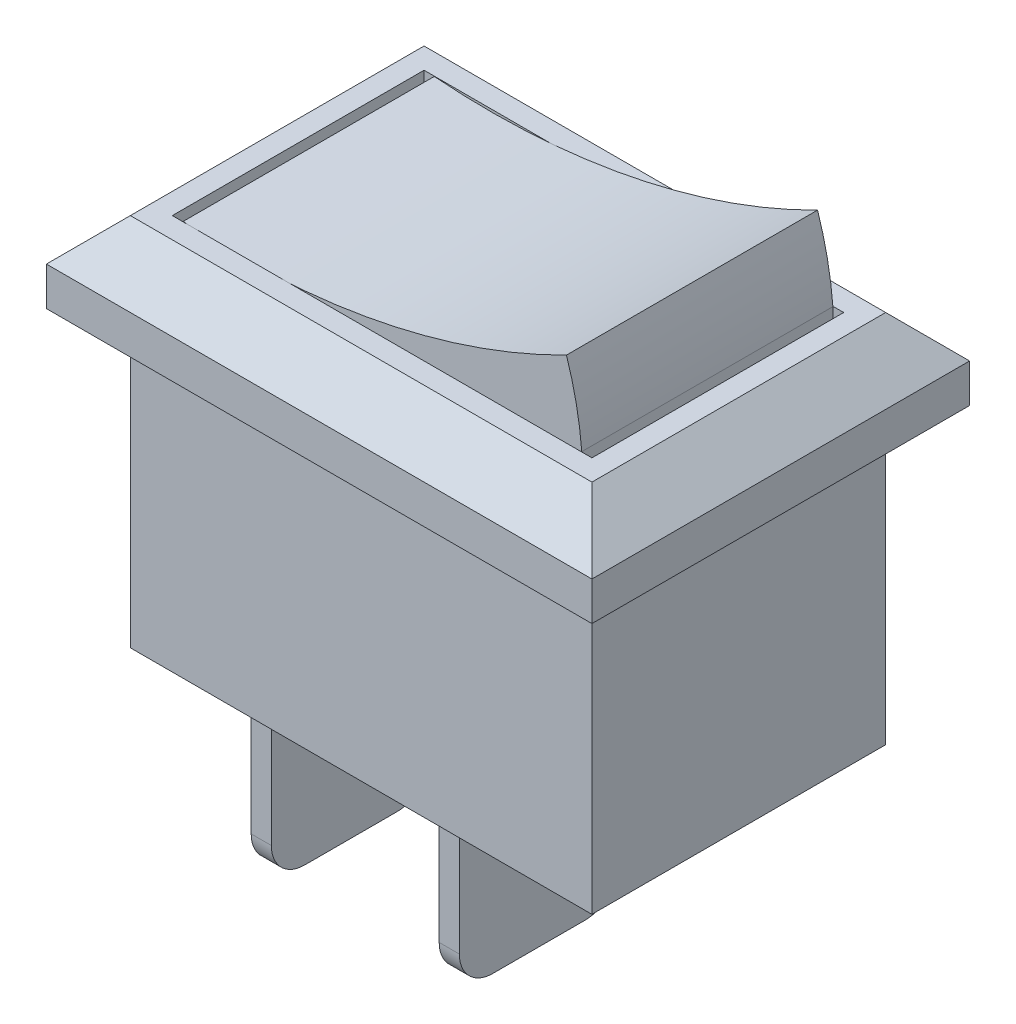
ISO-10303-21;
HEADER;
FILE_DESCRIPTION(('STEP AP214'),'2;1');
FILE_NAME('part.step','',(''),(''),'','','');
FILE_SCHEMA(('AUTOMOTIVE_DESIGN { 1 0 10303 214 1 1 1 1 }'));
ENDSEC;
DATA;
#1=APPLICATION_CONTEXT('core data for automotive mechanical design processes');
#2=APPLICATION_PROTOCOL_DEFINITION('international standard','automotive_design',2000,#1);
#3=PRODUCT_CONTEXT('',#1,'mechanical');
#4=PRODUCT('Part','Part','',(#3));
#5=PRODUCT_RELATED_PRODUCT_CATEGORY('part','',(#4));
#6=PRODUCT_DEFINITION_FORMATION('','',#4);
#7=PRODUCT_DEFINITION_CONTEXT('part definition',#1,'design');
#8=PRODUCT_DEFINITION('design','',#6,#7);
#9=PRODUCT_DEFINITION_SHAPE('','',#8);
#10=(LENGTH_UNIT() NAMED_UNIT(*) SI_UNIT(.MILLI.,.METRE.));
#11=(NAMED_UNIT(*) PLANE_ANGLE_UNIT() SI_UNIT($,.RADIAN.));
#12=(NAMED_UNIT(*) SI_UNIT($,.STERADIAN.) SOLID_ANGLE_UNIT());
#13=UNCERTAINTY_MEASURE_WITH_UNIT(LENGTH_MEASURE(1.E-05),#10,'distance_accuracy_value','');
#14=(GEOMETRIC_REPRESENTATION_CONTEXT(3) GLOBAL_UNCERTAINTY_ASSIGNED_CONTEXT((#13)) GLOBAL_UNIT_ASSIGNED_CONTEXT((#10,
#11,#12)) REPRESENTATION_CONTEXT('',''));
#15=CARTESIAN_POINT('',(0.,0.,0.));
#16=DIRECTION('',(0.,0.,1.));
#17=DIRECTION('',(1.,0.,0.));
#18=AXIS2_PLACEMENT_3D('',#15,#16,#17);
#19=CARTESIAN_POINT('',(0.,0.,0.));
#20=DIRECTION('',(0.,-1.,0.));
#21=DIRECTION('',(0.,0.,-1.));
#22=AXIS2_PLACEMENT_3D('',#19,#20,#21);
#23=PLANE('',#22);
#24=DIRECTION('',(0.,0.,1.));
#25=VECTOR('',#24,1.);
#26=CARTESIAN_POINT('',(0.,0.,0.));
#27=LINE('',#26,#25);
#28=CARTESIAN_POINT('',(0.,0.,-11.1125));
#29=VERTEX_POINT('',#28);
#30=CARTESIAN_POINT('',(0.,0.,0.));
#31=VERTEX_POINT('',#30);
#32=EDGE_CURVE('E614',#29,#31,#27,.T.);
#33=ORIENTED_EDGE('',*,*,#32,.F.);
#34=DIRECTION('',(-1.,0.,0.));
#35=VECTOR('',#34,1.);
#36=CARTESIAN_POINT('',(0.,0.,-11.1125));
#37=LINE('',#36,#35);
#38=CARTESIAN_POINT('',(17.4625,0.,-11.1125));
#39=VERTEX_POINT('',#38);
#40=EDGE_CURVE('E604',#39,#29,#37,.T.);
#41=ORIENTED_EDGE('',*,*,#40,.F.);
#42=DIRECTION('',(0.,0.,-1.));
#43=VECTOR('',#42,1.);
#44=CARTESIAN_POINT('',(17.4625,0.,0.));
#45=LINE('',#44,#43);
#46=CARTESIAN_POINT('',(17.4625,0.,0.));
#47=VERTEX_POINT('',#46);
#48=EDGE_CURVE('E608',#47,#39,#45,.T.);
#49=ORIENTED_EDGE('',*,*,#48,.F.);
#50=DIRECTION('',(1.,0.,0.));
#51=VECTOR('',#50,1.);
#52=CARTESIAN_POINT('',(0.,0.,0.));
#53=LINE('',#52,#51);
#54=EDGE_CURVE('E611',#31,#47,#53,.T.);
#55=ORIENTED_EDGE('',*,*,#54,.F.);
#56=EDGE_LOOP('',(#33,#41,#49,#55));
#57=FACE_BOUND('',#56,.T.);
#58=DIRECTION('',(1.,0.,0.));
#59=VECTOR('',#58,1.);
#60=CARTESIAN_POINT('',(2.032,0.,-8.5725));
#61=LINE('',#60,#59);
#62=CARTESIAN_POINT('',(2.032,0.,-8.5725));
#63=VERTEX_POINT('',#62);
#64=CARTESIAN_POINT('',(2.794,0.,-8.5725));
#65=VERTEX_POINT('',#64);
#66=EDGE_CURVE('E305',#63,#65,#61,.T.);
#67=ORIENTED_EDGE('',*,*,#66,.F.);
#68=DIRECTION('',(0.,0.,-1.));
#69=VECTOR('',#68,1.);
#70=CARTESIAN_POINT('',(2.032,0.,-2.54));
#71=LINE('',#70,#69);
#72=CARTESIAN_POINT('',(2.032,0.,-2.54));
#73=VERTEX_POINT('',#72);
#74=EDGE_CURVE('E259',#73,#63,#71,.T.);
#75=ORIENTED_EDGE('',*,*,#74,.F.);
#76=DIRECTION('',(-1.,0.,0.));
#77=VECTOR('',#76,1.);
#78=CARTESIAN_POINT('',(2.032,0.,-2.54));
#79=LINE('',#78,#77);
#80=CARTESIAN_POINT('',(2.794,0.,-2.54));
#81=VERTEX_POINT('',#80);
#82=EDGE_CURVE('E297',#81,#73,#79,.T.);
#83=ORIENTED_EDGE('',*,*,#82,.F.);
#84=DIRECTION('',(0.,0.,1.));
#85=VECTOR('',#84,1.);
#86=CARTESIAN_POINT('',(2.794,0.,-2.54));
#87=LINE('',#86,#85);
#88=EDGE_CURVE('E309',#65,#81,#87,.T.);
#89=ORIENTED_EDGE('',*,*,#88,.F.);
#90=EDGE_LOOP('',(#67,#75,#83,#89));
#91=FACE_BOUND('',#90,.T.);
#92=DIRECTION('',(1.,0.,0.));
#93=VECTOR('',#92,1.);
#94=CARTESIAN_POINT('',(9.144,0.,-8.5725));
#95=LINE('',#94,#93);
#96=CARTESIAN_POINT('',(9.144,0.,-8.5725));
#97=VERTEX_POINT('',#96);
#98=CARTESIAN_POINT('',(9.906,0.,-8.5725));
#99=VERTEX_POINT('',#98);
#100=EDGE_CURVE('E252',#97,#99,#95,.T.);
#101=ORIENTED_EDGE('',*,*,#100,.F.);
#102=DIRECTION('',(0.,0.,-1.));
#103=VECTOR('',#102,1.);
#104=CARTESIAN_POINT('',(9.144,0.,-2.54));
#105=LINE('',#104,#103);
#106=CARTESIAN_POINT('',(9.144,0.,-2.54));
#107=VERTEX_POINT('',#106);
#108=EDGE_CURVE('E263',#107,#97,#105,.T.);
#109=ORIENTED_EDGE('',*,*,#108,.F.);
#110=DIRECTION('',(-1.,0.,0.));
#111=VECTOR('',#110,1.);
#112=CARTESIAN_POINT('',(9.144,0.,-2.54));
#113=LINE('',#112,#111);
#114=CARTESIAN_POINT('',(9.906,0.,-2.54));
#115=VERTEX_POINT('',#114);
#116=EDGE_CURVE('E277',#115,#107,#113,.T.);
#117=ORIENTED_EDGE('',*,*,#116,.F.);
#118=DIRECTION('',(0.,0.,1.));
#119=VECTOR('',#118,1.);
#120=CARTESIAN_POINT('',(9.906,0.,-2.54));
#121=LINE('',#120,#119);
#122=EDGE_CURVE('E273',#99,#115,#121,.T.);
#123=ORIENTED_EDGE('',*,*,#122,.F.);
#124=EDGE_LOOP('',(#101,#109,#117,#123));
#125=FACE_BOUND('',#124,.T.);
#126=ADVANCED_FACE('F43',(#57,#91,#125),#23,.T.);
#127=CARTESIAN_POINT('',(0.,10.9855,0.));
#128=DIRECTION('',(0.,1.,0.));
#129=DIRECTION('',(0.,0.,1.));
#130=AXIS2_PLACEMENT_3D('',#127,#128,#129);
#131=PLANE('',#130);
#132=DIRECTION('',(0.,0.,1.));
#133=VECTOR('',#132,1.);
#134=CARTESIAN_POINT('',(0.793749999999999,10.9855,-10.31875));
#135=LINE('',#134,#133);
#136=CARTESIAN_POINT('',(0.793749999999999,10.9855,-10.31875));
#137=VERTEX_POINT('',#136);
#138=CARTESIAN_POINT('',(0.79375,10.9855,-0.79375));
#139=VERTEX_POINT('',#138);
#140=EDGE_CURVE('E676',#137,#139,#135,.T.);
#141=ORIENTED_EDGE('',*,*,#140,.T.);
#142=DIRECTION('',(1.,0.,0.));
#143=VECTOR('',#142,1.);
#144=CARTESIAN_POINT('',(0.79375,10.9855,-0.79375));
#145=LINE('',#144,#143);
#146=CARTESIAN_POINT('',(16.66875,10.9855,-0.79375));
#147=VERTEX_POINT('',#146);
#148=EDGE_CURVE('E696',#139,#147,#145,.T.);
#149=ORIENTED_EDGE('',*,*,#148,.T.);
#150=DIRECTION('',(0.,0.,-1.));
#151=VECTOR('',#150,1.);
#152=CARTESIAN_POINT('',(16.66875,10.9855,-10.31875));
#153=LINE('',#152,#151);
#154=CARTESIAN_POINT('',(16.66875,10.9855,-10.31875));
#155=VERTEX_POINT('',#154);
#156=EDGE_CURVE('E692',#147,#155,#153,.T.);
#157=ORIENTED_EDGE('',*,*,#156,.T.);
#158=DIRECTION('',(-1.,0.,0.));
#159=VECTOR('',#158,1.);
#160=CARTESIAN_POINT('',(0.793749999999999,10.9855,-10.31875));
#161=LINE('',#160,#159);
#162=EDGE_CURVE('E664',#155,#137,#161,.T.);
#163=ORIENTED_EDGE('',*,*,#162,.T.);
#164=EDGE_LOOP('',(#141,#149,#157,#163));
#165=FACE_BOUND('',#164,.T.);
#166=DIRECTION('',(0.,0.,1.));
#167=VECTOR('',#166,1.);
#168=CARTESIAN_POINT('',(1.190625,10.9855,-10.30605));
#169=LINE('',#168,#167);
#170=CARTESIAN_POINT('',(1.190625,10.9855,-10.30605));
#171=VERTEX_POINT('',#170);
#172=CARTESIAN_POINT('',(1.19062499999999,10.9855,-0.806449999999999));
#173=VERTEX_POINT('',#172);
#174=EDGE_CURVE('E703',#171,#173,#169,.T.);
#175=ORIENTED_EDGE('',*,*,#174,.F.);
#176=DIRECTION('',(1.,0.,0.));
#177=VECTOR('',#176,1.);
#178=CARTESIAN_POINT('',(1.190625,10.9855,-10.30605));
#179=LINE('',#178,#177);
#180=CARTESIAN_POINT('',(16.271875,10.9855,-10.30605));
#181=VERTEX_POINT('',#180);
#182=EDGE_CURVE('E356',#171,#181,#179,.T.);
#183=ORIENTED_EDGE('',*,*,#182,.T.);
#184=DIRECTION('',(0.,0.,1.));
#185=VECTOR('',#184,1.);
#186=CARTESIAN_POINT('',(16.271875,10.9855,-10.30605));
#187=LINE('',#186,#185);
#188=CARTESIAN_POINT('',(16.271875,10.9855,-0.806449999999999));
#189=VERTEX_POINT('',#188);
#190=EDGE_CURVE('E707',#181,#189,#187,.T.);
#191=ORIENTED_EDGE('',*,*,#190,.T.);
#192=DIRECTION('',(1.,0.,0.));
#193=VECTOR('',#192,1.);
#194=CARTESIAN_POINT('',(1.190625,10.9855,-0.806449999999999));
#195=LINE('',#194,#193);
#196=EDGE_CURVE('E331',#173,#189,#195,.T.);
#197=ORIENTED_EDGE('',*,*,#196,.F.);
#198=EDGE_LOOP('',(#175,#183,#191,#197));
#199=FACE_BOUND('',#198,.T.);
#200=ADVANCED_FACE('F393',(#165,#199),#131,.T.);
#201=CARTESIAN_POINT('',(0.,11.1125,0.));
#202=DIRECTION('',(1.,0.,0.));
#203=DIRECTION('',(0.,0.,-1.));
#204=AXIS2_PLACEMENT_3D('',#201,#202,#203);
#205=PLANE('',#204);
#206=ORIENTED_EDGE('',*,*,#32,.T.);
#207=DIRECTION('',(0.,-1.,0.));
#208=VECTOR('',#207,1.);
#209=CARTESIAN_POINT('',(0.,11.1125,0.));
#210=LINE('',#209,#208);
#211=CARTESIAN_POINT('',(0.,11.1125,0.));
#212=VERTEX_POINT('',#211);
#213=EDGE_CURVE('E587',#212,#31,#210,.T.);
#214=ORIENTED_EDGE('',*,*,#213,.F.);
#215=DIRECTION('',(0.,0.,1.));
#216=VECTOR('',#215,1.);
#217=CARTESIAN_POINT('',(0.,11.1125,0.));
#218=LINE('',#217,#216);
#219=CARTESIAN_POINT('',(0.,11.1125,-11.1125));
#220=VERTEX_POINT('',#219);
#221=EDGE_CURVE('E607',#220,#212,#218,.T.);
#222=ORIENTED_EDGE('',*,*,#221,.F.);
#223=DIRECTION('',(0.,-1.,0.));
#224=VECTOR('',#223,1.);
#225=CARTESIAN_POINT('',(0.,11.1125,-11.1125));
#226=LINE('',#225,#224);
#227=EDGE_CURVE('E599',#220,#29,#226,.T.);
#228=ORIENTED_EDGE('',*,*,#227,.T.);
#229=EDGE_LOOP('',(#206,#214,#222,#228));
#230=FACE_BOUND('',#229,.T.);
#231=ADVANCED_FACE('F396',(#230),#205,.F.);
#232=CARTESIAN_POINT('',(0.,11.1125,0.));
#233=DIRECTION('',(0.,0.,-1.));
#234=DIRECTION('',(-1.,0.,0.));
#235=AXIS2_PLACEMENT_3D('',#232,#233,#234);
#236=PLANE('',#235);
#237=ORIENTED_EDGE('',*,*,#54,.T.);
#238=DIRECTION('',(0.,-1.,0.));
#239=VECTOR('',#238,1.);
#240=CARTESIAN_POINT('',(17.4625,11.1125,0.));
#241=LINE('',#240,#239);
#242=CARTESIAN_POINT('',(17.4625,11.1125,0.));
#243=VERTEX_POINT('',#242);
#244=EDGE_CURVE('E591',#243,#47,#241,.T.);
#245=ORIENTED_EDGE('',*,*,#244,.F.);
#246=DIRECTION('',(1.,0.,0.));
#247=VECTOR('',#246,1.);
#248=CARTESIAN_POINT('',(0.,11.1125,0.));
#249=LINE('',#248,#247);
#250=EDGE_CURVE('E626',#212,#243,#249,.T.);
#251=ORIENTED_EDGE('',*,*,#250,.F.);
#252=ORIENTED_EDGE('',*,*,#213,.T.);
#253=EDGE_LOOP('',(#237,#245,#251,#252));
#254=FACE_BOUND('',#253,.T.);
#255=ADVANCED_FACE('F449',(#254),#236,.F.);
#256=CARTESIAN_POINT('',(17.4625,11.1125,0.));
#257=DIRECTION('',(-1.,0.,0.));
#258=DIRECTION('',(0.,0.,1.));
#259=AXIS2_PLACEMENT_3D('',#256,#257,#258);
#260=PLANE('',#259);
#261=ORIENTED_EDGE('',*,*,#48,.T.);
#262=DIRECTION('',(0.,-1.,0.));
#263=VECTOR('',#262,1.);
#264=CARTESIAN_POINT('',(17.4625,11.1125,-11.1125));
#265=LINE('',#264,#263);
#266=CARTESIAN_POINT('',(17.4625,11.1125,-11.1125));
#267=VERTEX_POINT('',#266);
#268=EDGE_CURVE('E595',#267,#39,#265,.T.);
#269=ORIENTED_EDGE('',*,*,#268,.F.);
#270=DIRECTION('',(0.,0.,-1.));
#271=VECTOR('',#270,1.);
#272=CARTESIAN_POINT('',(17.4625,11.1125,0.));
#273=LINE('',#272,#271);
#274=EDGE_CURVE('E622',#243,#267,#273,.T.);
#275=ORIENTED_EDGE('',*,*,#274,.F.);
#276=ORIENTED_EDGE('',*,*,#244,.T.);
#277=EDGE_LOOP('',(#261,#269,#275,#276));
#278=FACE_BOUND('',#277,.T.);
#279=ADVANCED_FACE('F445',(#278),#260,.F.);
#280=CARTESIAN_POINT('',(0.,11.1125,-11.1125));
#281=DIRECTION('',(0.,0.,1.));
#282=DIRECTION('',(1.,0.,0.));
#283=AXIS2_PLACEMENT_3D('',#280,#281,#282);
#284=PLANE('',#283);
#285=ORIENTED_EDGE('',*,*,#40,.T.);
#286=ORIENTED_EDGE('',*,*,#227,.F.);
#287=DIRECTION('',(-1.,0.,0.));
#288=VECTOR('',#287,1.);
#289=CARTESIAN_POINT('',(0.,11.1125,-11.1125));
#290=LINE('',#289,#288);
#291=EDGE_CURVE('E603',#267,#220,#290,.T.);
#292=ORIENTED_EDGE('',*,*,#291,.F.);
#293=ORIENTED_EDGE('',*,*,#268,.T.);
#294=EDGE_LOOP('',(#285,#286,#292,#293));
#295=FACE_BOUND('',#294,.T.);
#296=ADVANCED_FACE('F424',(#295),#284,.F.);
#297=CARTESIAN_POINT('',(0.,11.1125,0.));
#298=DIRECTION('',(0.,1.,0.));
#299=DIRECTION('',(0.,0.,1.));
#300=AXIS2_PLACEMENT_3D('',#297,#298,#299);
#301=PLANE('',#300);
#302=DIRECTION('',(0.,0.,1.));
#303=VECTOR('',#302,1.);
#304=CARTESIAN_POINT('',(-1.5875,11.1125,-12.7));
#305=LINE('',#304,#303);
#306=CARTESIAN_POINT('',(-1.5875,11.1125,-12.7));
#307=VERTEX_POINT('',#306);
#308=CARTESIAN_POINT('',(-1.5875,11.1125,1.5875));
#309=VERTEX_POINT('',#308);
#310=EDGE_CURVE('E550',#307,#309,#305,.T.);
#311=ORIENTED_EDGE('',*,*,#310,.F.);
#312=DIRECTION('',(-1.,0.,0.));
#313=VECTOR('',#312,1.);
#314=CARTESIAN_POINT('',(-1.5875,11.1125,-12.7));
#315=LINE('',#314,#313);
#316=CARTESIAN_POINT('',(19.05,11.1125,-12.7));
#317=VERTEX_POINT('',#316);
#318=EDGE_CURVE('E644',#317,#307,#315,.T.);
#319=ORIENTED_EDGE('',*,*,#318,.F.);
#320=DIRECTION('',(0.,0.,-1.));
#321=VECTOR('',#320,1.);
#322=CARTESIAN_POINT('',(19.05,11.1125,-12.7));
#323=LINE('',#322,#321);
#324=CARTESIAN_POINT('',(19.05,11.1125,1.5875));
#325=VERTEX_POINT('',#324);
#326=EDGE_CURVE('E648',#325,#317,#323,.T.);
#327=ORIENTED_EDGE('',*,*,#326,.F.);
#328=DIRECTION('',(1.,0.,0.));
#329=VECTOR('',#328,1.);
#330=CARTESIAN_POINT('',(-1.5875,11.1125,1.5875));
#331=LINE('',#330,#329);
#332=EDGE_CURVE('E652',#309,#325,#331,.T.);
#333=ORIENTED_EDGE('',*,*,#332,.F.);
#334=EDGE_LOOP('',(#311,#319,#327,#333));
#335=FACE_BOUND('',#334,.T.);
#336=ORIENTED_EDGE('',*,*,#291,.T.);
#337=ORIENTED_EDGE('',*,*,#221,.T.);
#338=ORIENTED_EDGE('',*,*,#250,.T.);
#339=ORIENTED_EDGE('',*,*,#274,.T.);
#340=EDGE_LOOP('',(#336,#337,#338,#339));
#341=FACE_BOUND('',#340,.T.);
#342=ADVANCED_FACE('F420',(#335,#341),#301,.F.);
#343=CARTESIAN_POINT('',(-1.5875,14.1605,-12.7));
#344=DIRECTION('',(1.,0.,0.));
#345=DIRECTION('',(0.,0.,-1.));
#346=AXIS2_PLACEMENT_3D('',#343,#344,#345);
#347=PLANE('',#346);
#348=DIRECTION('',(0.,-1.,0.));
#349=VECTOR('',#348,1.);
#350=CARTESIAN_POINT('',(-1.5875,14.1605,1.5875));
#351=LINE('',#350,#349);
#352=CARTESIAN_POINT('',(-1.5875,12.573,1.5875));
#353=VERTEX_POINT('',#352);
#354=EDGE_CURVE('E618',#353,#309,#351,.T.);
#355=ORIENTED_EDGE('',*,*,#354,.F.);
#356=DIRECTION('',(0.,0.,-1.));
#357=VECTOR('',#356,1.);
#358=CARTESIAN_POINT('',(-1.5875,12.573,-12.7));
#359=LINE('',#358,#357);
#360=CARTESIAN_POINT('',(-1.5875,12.573,-12.7));
#361=VERTEX_POINT('',#360);
#362=EDGE_CURVE('E545',#353,#361,#359,.T.);
#363=ORIENTED_EDGE('',*,*,#362,.T.);
#364=DIRECTION('',(0.,-1.,0.));
#365=VECTOR('',#364,1.);
#366=CARTESIAN_POINT('',(-1.5875,14.1605,-12.7));
#367=LINE('',#366,#365);
#368=EDGE_CURVE('E641',#361,#307,#367,.T.);
#369=ORIENTED_EDGE('',*,*,#368,.T.);
#370=ORIENTED_EDGE('',*,*,#310,.T.);
#371=EDGE_LOOP('',(#355,#363,#369,#370));
#372=FACE_BOUND('',#371,.T.);
#373=ADVANCED_FACE('F423',(#372),#347,.F.);
#374=CARTESIAN_POINT('',(-1.5875,14.1605,1.5875));
#375=DIRECTION('',(0.,0.,-1.));
#376=DIRECTION('',(-1.,0.,0.));
#377=AXIS2_PLACEMENT_3D('',#374,#375,#376);
#378=PLANE('',#377);
#379=DIRECTION('',(0.,-1.,0.));
#380=VECTOR('',#379,1.);
#381=CARTESIAN_POINT('',(19.05,14.1605,1.5875));
#382=LINE('',#381,#380);
#383=CARTESIAN_POINT('',(19.05,12.573,1.5875));
#384=VERTEX_POINT('',#383);
#385=EDGE_CURVE('E635',#384,#325,#382,.T.);
#386=ORIENTED_EDGE('',*,*,#385,.F.);
#387=DIRECTION('',(-1.,0.,0.));
#388=VECTOR('',#387,1.);
#389=CARTESIAN_POINT('',(-1.5875,12.573,1.5875));
#390=LINE('',#389,#388);
#391=EDGE_CURVE('E564',#384,#353,#390,.T.);
#392=ORIENTED_EDGE('',*,*,#391,.T.);
#393=ORIENTED_EDGE('',*,*,#354,.T.);
#394=ORIENTED_EDGE('',*,*,#332,.T.);
#395=EDGE_LOOP('',(#386,#392,#393,#394));
#396=FACE_BOUND('',#395,.T.);
#397=ADVANCED_FACE('F432',(#396),#378,.F.);
#398=CARTESIAN_POINT('',(19.05,14.1605,-12.7));
#399=DIRECTION('',(-1.,0.,0.));
#400=DIRECTION('',(0.,0.,1.));
#401=AXIS2_PLACEMENT_3D('',#398,#399,#400);
#402=PLANE('',#401);
#403=DIRECTION('',(0.,-1.,0.));
#404=VECTOR('',#403,1.);
#405=CARTESIAN_POINT('',(19.05,14.1605,-12.7));
#406=LINE('',#405,#404);
#407=CARTESIAN_POINT('',(19.05,12.573,-12.7));
#408=VERTEX_POINT('',#407);
#409=EDGE_CURVE('E638',#408,#317,#406,.T.);
#410=ORIENTED_EDGE('',*,*,#409,.F.);
#411=DIRECTION('',(0.,0.,1.));
#412=VECTOR('',#411,1.);
#413=CARTESIAN_POINT('',(19.05,12.573,1.5875));
#414=LINE('',#413,#412);
#415=EDGE_CURVE('E567',#408,#384,#414,.T.);
#416=ORIENTED_EDGE('',*,*,#415,.T.);
#417=ORIENTED_EDGE('',*,*,#385,.T.);
#418=ORIENTED_EDGE('',*,*,#326,.T.);
#419=EDGE_LOOP('',(#410,#416,#417,#418));
#420=FACE_BOUND('',#419,.T.);
#421=ADVANCED_FACE('F428',(#420),#402,.F.);
#422=CARTESIAN_POINT('',(-1.5875,14.1605,-12.7));
#423=DIRECTION('',(0.,0.,1.));
#424=DIRECTION('',(1.,0.,0.));
#425=AXIS2_PLACEMENT_3D('',#422,#423,#424);
#426=PLANE('',#425);
#427=ORIENTED_EDGE('',*,*,#368,.F.);
#428=DIRECTION('',(1.,0.,0.));
#429=VECTOR('',#428,1.);
#430=CARTESIAN_POINT('',(19.05,12.573,-12.7));
#431=LINE('',#430,#429);
#432=EDGE_CURVE('E570',#361,#408,#431,.T.);
#433=ORIENTED_EDGE('',*,*,#432,.T.);
#434=ORIENTED_EDGE('',*,*,#409,.T.);
#435=ORIENTED_EDGE('',*,*,#318,.T.);
#436=EDGE_LOOP('',(#427,#433,#434,#435));
#437=FACE_BOUND('',#436,.T.);
#438=ADVANCED_FACE('F418',(#437),#426,.F.);
#439=CARTESIAN_POINT('',(0.,14.1605,0.));
#440=DIRECTION('',(0.,1.,0.));
#441=DIRECTION('',(0.,0.,1.));
#442=AXIS2_PLACEMENT_3D('',#439,#440,#441);
#443=PLANE('',#442);
#444=DIRECTION('',(0.,0.,1.));
#445=VECTOR('',#444,1.);
#446=CARTESIAN_POINT('',(0.793749999999999,14.1605,-10.31875));
#447=LINE('',#446,#445);
#448=CARTESIAN_POINT('',(0.793749999999999,14.1605,-10.31875));
#449=VERTEX_POINT('',#448);
#450=CARTESIAN_POINT('',(0.79375,14.1605,-0.79375));
#451=VERTEX_POINT('',#450);
#452=EDGE_CURVE('E685',#449,#451,#447,.T.);
#453=ORIENTED_EDGE('',*,*,#452,.F.);
#454=DIRECTION('',(-1.,0.,0.));
#455=VECTOR('',#454,1.);
#456=CARTESIAN_POINT('',(0.793749999999999,14.1605,-10.31875));
#457=LINE('',#456,#455);
#458=CARTESIAN_POINT('',(16.66875,14.1605,-10.31875));
#459=VERTEX_POINT('',#458);
#460=EDGE_CURVE('E672',#459,#449,#457,.T.);
#461=ORIENTED_EDGE('',*,*,#460,.F.);
#462=DIRECTION('',(0.,0.,-1.));
#463=VECTOR('',#462,1.);
#464=CARTESIAN_POINT('',(16.66875,14.1605,-10.31875));
#465=LINE('',#464,#463);
#466=CARTESIAN_POINT('',(16.66875,14.1605,-0.79375));
#467=VERTEX_POINT('',#466);
#468=EDGE_CURVE('E677',#467,#459,#465,.T.);
#469=ORIENTED_EDGE('',*,*,#468,.F.);
#470=DIRECTION('',(1.,0.,0.));
#471=VECTOR('',#470,1.);
#472=CARTESIAN_POINT('',(0.79375,14.1605,-0.79375));
#473=LINE('',#472,#471);
#474=EDGE_CURVE('E681',#451,#467,#473,.T.);
#475=ORIENTED_EDGE('',*,*,#474,.F.);
#476=EDGE_LOOP('',(#453,#461,#469,#475));
#477=FACE_BOUND('',#476,.T.);
#478=DIRECTION('',(0.,0.,-1.));
#479=VECTOR('',#478,1.);
#480=CARTESIAN_POINT('',(17.4625,14.1605,-12.7));
#481=LINE('',#480,#479);
#482=CARTESIAN_POINT('',(17.4625,14.1605,0.));
#483=VERTEX_POINT('',#482);
#484=CARTESIAN_POINT('',(17.4625,14.1605,-11.1125));
#485=VERTEX_POINT('',#484);
#486=EDGE_CURVE('E578',#483,#485,#481,.T.);
#487=ORIENTED_EDGE('',*,*,#486,.T.);
#488=DIRECTION('',(-1.,0.,0.));
#489=VECTOR('',#488,1.);
#490=CARTESIAN_POINT('',(-1.5875,14.1605,-11.1125));
#491=LINE('',#490,#489);
#492=CARTESIAN_POINT('',(0.,14.1605,-11.1125));
#493=VERTEX_POINT('',#492);
#494=EDGE_CURVE('E574',#485,#493,#491,.T.);
#495=ORIENTED_EDGE('',*,*,#494,.T.);
#496=DIRECTION('',(0.,0.,1.));
#497=VECTOR('',#496,1.);
#498=CARTESIAN_POINT('',(0.,14.1605,1.5875));
#499=LINE('',#498,#497);
#500=CARTESIAN_POINT('',(0.,14.1605,0.));
#501=VERTEX_POINT('',#500);
#502=EDGE_CURVE('E584',#493,#501,#499,.T.);
#503=ORIENTED_EDGE('',*,*,#502,.T.);
#504=DIRECTION('',(1.,0.,0.));
#505=VECTOR('',#504,1.);
#506=CARTESIAN_POINT('',(19.05,14.1605,0.));
#507=LINE('',#506,#505);
#508=EDGE_CURVE('E581',#501,#483,#507,.T.);
#509=ORIENTED_EDGE('',*,*,#508,.T.);
#510=EDGE_LOOP('',(#487,#495,#503,#509));
#511=FACE_BOUND('',#510,.T.);
#512=ADVANCED_FACE('F414',(#477,#511),#443,.T.);
#513=CARTESIAN_POINT('',(0.,14.1605,0.));
#514=DIRECTION('',(0.,0.707106781186546,0.707106781186549));
#515=DIRECTION('',(-1.,0.,0.));
#516=AXIS2_PLACEMENT_3D('',#513,#514,#515);
#517=PLANE('',#516);
#518=DIRECTION('',(0.577350269189625,0.577350269189627,-0.577350269189625));
#519=VECTOR('',#518,1.);
#520=CARTESIAN_POINT('',(0.,14.1605,0.));
#521=LINE('',#520,#519);
#522=EDGE_CURVE('E551',#353,#501,#521,.T.);
#523=ORIENTED_EDGE('',*,*,#522,.F.);
#524=ORIENTED_EDGE('',*,*,#391,.F.);
#525=DIRECTION('',(-0.577350269189624,0.577350269189628,-0.577350269189626));
#526=VECTOR('',#525,1.);
#527=CARTESIAN_POINT('',(11.6416666666667,19.9813333333333,-5.82083333333332));
#528=LINE('',#527,#526);
#529=EDGE_CURVE('E546',#483,#384,#528,.F.);
#530=ORIENTED_EDGE('',*,*,#529,.F.);
#531=ORIENTED_EDGE('',*,*,#508,.F.);
#532=EDGE_LOOP('',(#523,#524,#530,#531));
#533=FACE_BOUND('',#532,.T.);
#534=ADVANCED_FACE('F417',(#533),#517,.T.);
#535=CARTESIAN_POINT('',(17.4625,14.1605,0.));
#536=DIRECTION('',(0.70710678118655,0.707106781186545,0.));
#537=DIRECTION('',(0.,0.,1.));
#538=AXIS2_PLACEMENT_3D('',#535,#536,#537);
#539=PLANE('',#538);
#540=ORIENTED_EDGE('',*,*,#529,.T.);
#541=ORIENTED_EDGE('',*,*,#415,.F.);
#542=DIRECTION('',(-0.577350269189624,0.577350269189628,0.577350269189625));
#543=VECTOR('',#542,1.);
#544=CARTESIAN_POINT('',(13.7583333333334,17.8646666666667,-7.40833333333335));
#545=LINE('',#544,#543);
#546=EDGE_CURVE('E555',#485,#408,#545,.F.);
#547=ORIENTED_EDGE('',*,*,#546,.F.);
#548=ORIENTED_EDGE('',*,*,#486,.F.);
#549=EDGE_LOOP('',(#540,#541,#547,#548));
#550=FACE_BOUND('',#549,.T.);
#551=ADVANCED_FACE('F470',(#550),#539,.T.);
#552=CARTESIAN_POINT('',(0.,14.1605,0.));
#553=DIRECTION('',(-0.707106781186549,0.707106781186546,0.));
#554=DIRECTION('',(0.,0.,-1.));
#555=AXIS2_PLACEMENT_3D('',#552,#553,#554);
#556=PLANE('',#555);
#557=ORIENTED_EDGE('',*,*,#522,.T.);
#558=ORIENTED_EDGE('',*,*,#502,.F.);
#559=DIRECTION('',(-0.577350269189625,-0.577350269189628,-0.577350269189625));
#560=VECTOR('',#559,1.);
#561=CARTESIAN_POINT('',(3.70416666666665,17.8646666666667,-7.40833333333335));
#562=LINE('',#561,#560);
#563=EDGE_CURVE('E558',#361,#493,#562,.F.);
#564=ORIENTED_EDGE('',*,*,#563,.F.);
#565=ORIENTED_EDGE('',*,*,#362,.F.);
#566=EDGE_LOOP('',(#557,#558,#564,#565));
#567=FACE_BOUND('',#566,.T.);
#568=ADVANCED_FACE('F463',(#567),#556,.T.);
#569=CARTESIAN_POINT('',(0.,14.1605,-11.1125));
#570=DIRECTION('',(0.,0.707106781186545,-0.707106781186549));
#571=DIRECTION('',(1.,0.,0.));
#572=AXIS2_PLACEMENT_3D('',#569,#570,#571);
#573=PLANE('',#572);
#574=ORIENTED_EDGE('',*,*,#546,.T.);
#575=ORIENTED_EDGE('',*,*,#432,.F.);
#576=ORIENTED_EDGE('',*,*,#563,.T.);
#577=ORIENTED_EDGE('',*,*,#494,.F.);
#578=EDGE_LOOP('',(#574,#575,#576,#577));
#579=FACE_BOUND('',#578,.T.);
#580=ADVANCED_FACE('F412',(#579),#573,.T.);
#581=CARTESIAN_POINT('',(0.793749999999999,10.9855,-10.31875));
#582=DIRECTION('',(-1.,0.,0.));
#583=DIRECTION('',(0.,0.,1.));
#584=AXIS2_PLACEMENT_3D('',#581,#582,#583);
#585=PLANE('',#584);
#586=ORIENTED_EDGE('',*,*,#452,.T.);
#587=DIRECTION('',(0.,1.,0.));
#588=VECTOR('',#587,1.);
#589=CARTESIAN_POINT('',(0.79375,10.9855,-0.79375));
#590=LINE('',#589,#588);
#591=EDGE_CURVE('E659',#139,#451,#590,.T.);
#592=ORIENTED_EDGE('',*,*,#591,.F.);
#593=ORIENTED_EDGE('',*,*,#140,.F.);
#594=DIRECTION('',(0.,1.,0.));
#595=VECTOR('',#594,1.);
#596=CARTESIAN_POINT('',(0.793749999999999,10.9855,-10.31875));
#597=LINE('',#596,#595);
#598=EDGE_CURVE('E561',#137,#449,#597,.T.);
#599=ORIENTED_EDGE('',*,*,#598,.T.);
#600=EDGE_LOOP('',(#586,#592,#593,#599));
#601=FACE_BOUND('',#600,.T.);
#602=ADVANCED_FACE('F402',(#601),#585,.F.);
#603=CARTESIAN_POINT('',(0.793749999999999,10.9855,-10.31875));
#604=DIRECTION('',(0.,0.,-1.));
#605=DIRECTION('',(-1.,0.,0.));
#606=AXIS2_PLACEMENT_3D('',#603,#604,#605);
#607=PLANE('',#606);
#608=ORIENTED_EDGE('',*,*,#460,.T.);
#609=ORIENTED_EDGE('',*,*,#598,.F.);
#610=ORIENTED_EDGE('',*,*,#162,.F.);
#611=DIRECTION('',(0.,1.,0.));
#612=VECTOR('',#611,1.);
#613=CARTESIAN_POINT('',(16.66875,10.9855,-10.31875));
#614=LINE('',#613,#612);
#615=EDGE_CURVE('E667',#155,#459,#614,.T.);
#616=ORIENTED_EDGE('',*,*,#615,.T.);
#617=EDGE_LOOP('',(#608,#609,#610,#616));
#618=FACE_BOUND('',#617,.T.);
#619=ADVANCED_FACE('F398',(#618),#607,.F.);
#620=CARTESIAN_POINT('',(16.66875,10.9855,-10.31875));
#621=DIRECTION('',(1.,0.,0.));
#622=DIRECTION('',(0.,0.,-1.));
#623=AXIS2_PLACEMENT_3D('',#620,#621,#622);
#624=PLANE('',#623);
#625=ORIENTED_EDGE('',*,*,#468,.T.);
#626=ORIENTED_EDGE('',*,*,#615,.F.);
#627=ORIENTED_EDGE('',*,*,#156,.F.);
#628=DIRECTION('',(0.,1.,0.));
#629=VECTOR('',#628,1.);
#630=CARTESIAN_POINT('',(16.66875,10.9855,-0.79375));
#631=LINE('',#630,#629);
#632=EDGE_CURVE('E663',#147,#467,#631,.T.);
#633=ORIENTED_EDGE('',*,*,#632,.T.);
#634=EDGE_LOOP('',(#625,#626,#627,#633));
#635=FACE_BOUND('',#634,.T.);
#636=ADVANCED_FACE('F401',(#635),#624,.F.);
#637=CARTESIAN_POINT('',(0.79375,10.9855,-0.79375));
#638=DIRECTION('',(0.,0.,1.));
#639=DIRECTION('',(1.,0.,0.));
#640=AXIS2_PLACEMENT_3D('',#637,#638,#639);
#641=PLANE('',#640);
#642=ORIENTED_EDGE('',*,*,#474,.T.);
#643=ORIENTED_EDGE('',*,*,#632,.F.);
#644=ORIENTED_EDGE('',*,*,#148,.F.);
#645=ORIENTED_EDGE('',*,*,#591,.T.);
#646=EDGE_LOOP('',(#642,#643,#644,#645));
#647=FACE_BOUND('',#646,.T.);
#648=ADVANCED_FACE('F391',(#647),#641,.F.);
#649=CARTESIAN_POINT('',(1.190625,10.9855,-10.30605));
#650=DIRECTION('',(-1.,0.,0.));
#651=DIRECTION('',(0.,-1.,0.));
#652=AXIS2_PLACEMENT_3D('',#649,#650,#651);
#653=PLANE('',#652);
#654=ORIENTED_EDGE('',*,*,#174,.T.);
#655=DIRECTION('',(0.,-1.,0.));
#656=VECTOR('',#655,1.);
#657=CARTESIAN_POINT('',(1.190625,10.9855,-0.806449999999999));
#658=LINE('',#657,#656);
#659=CARTESIAN_POINT('',(1.19062499999999,14.1605,-0.806449999999999));
#660=VERTEX_POINT('',#659);
#661=EDGE_CURVE('E327',#660,#173,#658,.T.);
#662=ORIENTED_EDGE('',*,*,#661,.F.);
#663=DIRECTION('',(0.,0.,1.));
#664=VECTOR('',#663,1.);
#665=CARTESIAN_POINT('',(1.19062499999999,14.1605,-10.30605));
#666=LINE('',#665,#664);
#667=CARTESIAN_POINT('',(1.19062499999999,14.1605,-10.30605));
#668=VERTEX_POINT('',#667);
#669=EDGE_CURVE('E688',#668,#660,#666,.T.);
#670=ORIENTED_EDGE('',*,*,#669,.F.);
#671=DIRECTION('',(0.,-1.,0.));
#672=VECTOR('',#671,1.);
#673=CARTESIAN_POINT('',(1.190625,10.9855,-10.30605));
#674=LINE('',#673,#672);
#675=EDGE_CURVE('E352',#668,#171,#674,.T.);
#676=ORIENTED_EDGE('',*,*,#675,.T.);
#677=EDGE_LOOP('',(#654,#662,#670,#676));
#678=FACE_BOUND('',#677,.T.);
#679=ADVANCED_FACE('F388',(#678),#653,.T.);
#680=CARTESIAN_POINT('',(3.32274200331411,41.438412984258,-10.30605));
#681=DIRECTION('',(0.,0.,1.));
#682=DIRECTION('',(1.,0.,0.));
#683=AXIS2_PLACEMENT_3D('',#680,#681,#682);
#684=CYLINDRICAL_SURFACE('',#683,27.3611121793792);
#685=ORIENTED_EDGE('',*,*,#669,.T.);
#686=CARTESIAN_POINT('',(3.32274200331411,41.438412984258,-0.806449999999999));
#687=DIRECTION('',(0.,0.,-1.));
#688=DIRECTION('',(1.,0.,0.));
#689=AXIS2_PLACEMENT_3D('',#686,#687,#688);
#690=CIRCLE('',#689,27.3611121793792);
#691=CARTESIAN_POINT('',(15.6924073570747,17.0330480263528,-0.806449999999999));
#692=VERTEX_POINT('',#691);
#693=EDGE_CURVE('E345',#692,#660,#690,.T.);
#694=ORIENTED_EDGE('',*,*,#693,.F.);
#695=DIRECTION('',(0.,0.,1.));
#696=VECTOR('',#695,1.);
#697=CARTESIAN_POINT('',(15.6924073570747,17.0330480263528,-10.30605));
#698=LINE('',#697,#696);
#699=CARTESIAN_POINT('',(15.6924073570747,17.0330480263528,-10.30605));
#700=VERTEX_POINT('',#699);
#701=EDGE_CURVE('E713',#700,#692,#698,.T.);
#702=ORIENTED_EDGE('',*,*,#701,.F.);
#703=CARTESIAN_POINT('',(3.32274200331411,41.438412984258,-10.30605));
#704=DIRECTION('',(0.,0.,-1.));
#705=DIRECTION('',(1.,0.,0.));
#706=AXIS2_PLACEMENT_3D('',#703,#704,#705);
#707=CIRCLE('',#706,27.3611121793792);
#708=EDGE_CURVE('E370',#700,#668,#707,.T.);
#709=ORIENTED_EDGE('',*,*,#708,.T.);
#710=EDGE_LOOP('',(#685,#694,#702,#709));
#711=FACE_BOUND('',#710,.T.);
#712=ADVANCED_FACE('F381',(#711),#684,.F.);
#713=CARTESIAN_POINT('',(16.271875,14.1605,-10.30605));
#714=CARTESIAN_POINT('',(16.1534616983556,15.63229036623,-10.30605));
#715=CARTESIAN_POINT('',(15.6924073570747,17.0330480263528,-10.30605));
#716=B_SPLINE_CURVE_WITH_KNOTS('',2,(#713,#714,#715),.UNSPECIFIED.,.F.,.F.,(3,3),(0.,1.),.UNSPECIFIED.);
#717=DIRECTION('',(0.,0.,1.));
#718=VECTOR('',#717,1.);
#719=SURFACE_OF_LINEAR_EXTRUSION('',#716,#718);
#720=ORIENTED_EDGE('',*,*,#701,.T.);
#721=CARTESIAN_POINT('',(16.271875,14.1605,-0.806449999999999));
#722=CARTESIAN_POINT('',(16.1534616983556,15.63229036623,-0.806449999999999));
#723=CARTESIAN_POINT('',(15.6924073570747,17.0330480263528,-0.806449999999999));
#724=B_SPLINE_CURVE_WITH_KNOTS('',2,(#721,#722,#723),.UNSPECIFIED.,.F.,.F.,(3,3),(0.,1.),.UNSPECIFIED.);
#725=CARTESIAN_POINT('',(16.271875,14.1605,-0.806449999999999));
#726=VERTEX_POINT('',#725);
#727=EDGE_CURVE('E339',#726,#692,#724,.T.);
#728=ORIENTED_EDGE('',*,*,#727,.F.);
#729=DIRECTION('',(0.,0.,1.));
#730=VECTOR('',#729,1.);
#731=CARTESIAN_POINT('',(16.271875,14.1605,-10.30605));
#732=LINE('',#731,#730);
#733=CARTESIAN_POINT('',(16.271875,14.1605,-10.30605));
#734=VERTEX_POINT('',#733);
#735=EDGE_CURVE('E710',#734,#726,#732,.T.);
#736=ORIENTED_EDGE('',*,*,#735,.F.);
#737=EDGE_CURVE('E363',#734,#700,#716,.T.);
#738=ORIENTED_EDGE('',*,*,#737,.T.);
#739=EDGE_LOOP('',(#720,#728,#736,#738));
#740=FACE_BOUND('',#739,.T.);
#741=ADVANCED_FACE('F376',(#740),#719,.T.);
#742=CARTESIAN_POINT('',(16.271875,10.9855,-10.30605));
#743=DIRECTION('',(1.,0.,0.));
#744=DIRECTION('',(0.,0.,-1.));
#745=AXIS2_PLACEMENT_3D('',#742,#743,#744);
#746=PLANE('',#745);
#747=ORIENTED_EDGE('',*,*,#735,.T.);
#748=DIRECTION('',(0.,1.,0.));
#749=VECTOR('',#748,1.);
#750=CARTESIAN_POINT('',(16.271875,10.9855,-0.806449999999999));
#751=LINE('',#750,#749);
#752=EDGE_CURVE('E335',#189,#726,#751,.T.);
#753=ORIENTED_EDGE('',*,*,#752,.F.);
#754=ORIENTED_EDGE('',*,*,#190,.F.);
#755=DIRECTION('',(0.,1.,0.));
#756=VECTOR('',#755,1.);
#757=CARTESIAN_POINT('',(16.271875,10.9855,-10.30605));
#758=LINE('',#757,#756);
#759=EDGE_CURVE('E359',#181,#734,#758,.T.);
#760=ORIENTED_EDGE('',*,*,#759,.T.);
#761=EDGE_LOOP('',(#747,#753,#754,#760));
#762=FACE_BOUND('',#761,.T.);
#763=ADVANCED_FACE('F380',(#762),#746,.T.);
#764=CARTESIAN_POINT('',(3.32274200331411,41.438412984258,-10.30605));
#765=DIRECTION('',(0.,0.,1.));
#766=DIRECTION('',(1.,0.,0.));
#767=AXIS2_PLACEMENT_3D('',#764,#765,#766);
#768=PLANE('',#767);
#769=ORIENTED_EDGE('',*,*,#675,.F.);
#770=ORIENTED_EDGE('',*,*,#708,.F.);
#771=ORIENTED_EDGE('',*,*,#737,.F.);
#772=ORIENTED_EDGE('',*,*,#759,.F.);
#773=ORIENTED_EDGE('',*,*,#182,.F.);
#774=EDGE_LOOP('',(#769,#770,#771,#772,#773));
#775=FACE_BOUND('',#774,.T.);
#776=ADVANCED_FACE('F386',(#775),#768,.F.);
#777=CARTESIAN_POINT('',(3.32274200331411,41.438412984258,-0.806449999999999));
#778=DIRECTION('',(0.,0.,1.));
#779=DIRECTION('',(1.,0.,0.));
#780=AXIS2_PLACEMENT_3D('',#777,#778,#779);
#781=PLANE('',#780);
#782=ORIENTED_EDGE('',*,*,#661,.T.);
#783=ORIENTED_EDGE('',*,*,#196,.T.);
#784=ORIENTED_EDGE('',*,*,#752,.T.);
#785=ORIENTED_EDGE('',*,*,#727,.T.);
#786=ORIENTED_EDGE('',*,*,#693,.T.);
#787=EDGE_LOOP('',(#782,#783,#784,#785,#786));
#788=FACE_BOUND('',#787,.T.);
#789=ADVANCED_FACE('F723',(#788),#781,.T.);
#790=CARTESIAN_POINT('',(2.032,-7.62,-2.54));
#791=DIRECTION('',(1.,0.,0.));
#792=DIRECTION('',(0.,0.,-1.));
#793=AXIS2_PLACEMENT_3D('',#790,#791,#792);
#794=PLANE('',#793);
#795=DIRECTION('',(0.,0.,-1.));
#796=VECTOR('',#795,1.);
#797=CARTESIAN_POINT('',(2.032,-7.62,-2.54));
#798=LINE('',#797,#796);
#799=CARTESIAN_POINT('',(2.032,-7.62,-3.81));
#800=VERTEX_POINT('',#799);
#801=CARTESIAN_POINT('',(2.032,-7.62,-7.3025));
#802=VERTEX_POINT('',#801);
#803=EDGE_CURVE('E292',#800,#802,#798,.T.);
#804=ORIENTED_EDGE('',*,*,#803,.F.);
#805=CARTESIAN_POINT('',(2.032,-6.35,-3.81));
#806=DIRECTION('',(1.,0.,0.));
#807=DIRECTION('',(0.,0.,-1.));
#808=AXIS2_PLACEMENT_3D('',#805,#806,#807);
#809=CIRCLE('',#808,1.27);
#810=CARTESIAN_POINT('',(2.032,-6.35,-2.54));
#811=VERTEX_POINT('',#810);
#812=EDGE_CURVE('E508',#800,#811,#809,.F.);
#813=ORIENTED_EDGE('',*,*,#812,.T.);
#814=DIRECTION('',(0.,1.,0.));
#815=VECTOR('',#814,1.);
#816=CARTESIAN_POINT('',(2.032,-7.62,-2.54));
#817=LINE('',#816,#815);
#818=EDGE_CURVE('E301',#811,#73,#817,.T.);
#819=ORIENTED_EDGE('',*,*,#818,.T.);
#820=ORIENTED_EDGE('',*,*,#74,.T.);
#821=DIRECTION('',(0.,1.,0.));
#822=VECTOR('',#821,1.);
#823=CARTESIAN_POINT('',(2.032,-7.62,-8.5725));
#824=LINE('',#823,#822);
#825=CARTESIAN_POINT('',(2.032,-6.35,-8.5725));
#826=VERTEX_POINT('',#825);
#827=EDGE_CURVE('E324',#826,#63,#824,.T.);
#828=ORIENTED_EDGE('',*,*,#827,.F.);
#829=CARTESIAN_POINT('',(2.032,-6.35,-7.3025));
#830=DIRECTION('',(1.,0.,0.));
#831=DIRECTION('',(0.,0.,-1.));
#832=AXIS2_PLACEMENT_3D('',#829,#830,#831);
#833=CIRCLE('',#832,1.27);
#834=EDGE_CURVE('E511',#826,#802,#833,.F.);
#835=ORIENTED_EDGE('',*,*,#834,.T.);
#836=EDGE_LOOP('',(#804,#813,#819,#820,#828,#835));
#837=FACE_BOUND('',#836,.T.);
#838=ADVANCED_FACE('F776',(#837),#794,.F.);
#839=CARTESIAN_POINT('',(2.032,-7.62,-8.5725));
#840=DIRECTION('',(0.,0.,1.));
#841=DIRECTION('',(1.,0.,0.));
#842=AXIS2_PLACEMENT_3D('',#839,#840,#841);
#843=PLANE('',#842);
#844=DIRECTION('',(0.,1.,0.));
#845=VECTOR('',#844,1.);
#846=CARTESIAN_POINT('',(2.794,-7.62,-8.5725));
#847=LINE('',#846,#845);
#848=CARTESIAN_POINT('',(2.794,-6.35,-8.5725));
#849=VERTEX_POINT('',#848);
#850=EDGE_CURVE('E321',#849,#65,#847,.T.);
#851=ORIENTED_EDGE('',*,*,#850,.F.);
#852=DIRECTION('',(1.,0.,0.));
#853=VECTOR('',#852,1.);
#854=CARTESIAN_POINT('',(2.032,-6.35,-8.5725));
#855=LINE('',#854,#853);
#856=EDGE_CURVE('E11',#849,#826,#855,.F.);
#857=ORIENTED_EDGE('',*,*,#856,.T.);
#858=ORIENTED_EDGE('',*,*,#827,.T.);
#859=ORIENTED_EDGE('',*,*,#66,.T.);
#860=EDGE_LOOP('',(#851,#857,#858,#859));
#861=FACE_BOUND('',#860,.T.);
#862=ADVANCED_FACE('F773',(#861),#843,.F.);
#863=CARTESIAN_POINT('',(2.794,-7.62,-2.54));
#864=DIRECTION('',(-1.,0.,0.));
#865=DIRECTION('',(0.,0.,1.));
#866=AXIS2_PLACEMENT_3D('',#863,#864,#865);
#867=PLANE('',#866);
#868=DIRECTION('',(0.,1.,0.));
#869=VECTOR('',#868,1.);
#870=CARTESIAN_POINT('',(2.794,-7.62,-2.54));
#871=LINE('',#870,#869);
#872=CARTESIAN_POINT('',(2.794,-6.35,-2.54));
#873=VERTEX_POINT('',#872);
#874=EDGE_CURVE('E318',#873,#81,#871,.T.);
#875=ORIENTED_EDGE('',*,*,#874,.F.);
#876=CARTESIAN_POINT('',(2.794,-6.35,-3.81));
#877=DIRECTION('',(-1.,0.,0.));
#878=DIRECTION('',(0.,0.,1.));
#879=AXIS2_PLACEMENT_3D('',#876,#877,#878);
#880=CIRCLE('',#879,1.27);
#881=CARTESIAN_POINT('',(2.794,-7.62,-3.81));
#882=VERTEX_POINT('',#881);
#883=EDGE_CURVE('E52',#873,#882,#880,.F.);
#884=ORIENTED_EDGE('',*,*,#883,.T.);
#885=DIRECTION('',(0.,0.,1.));
#886=VECTOR('',#885,1.);
#887=CARTESIAN_POINT('',(2.794,-7.62,-2.54));
#888=LINE('',#887,#886);
#889=CARTESIAN_POINT('',(2.794,-7.62,-7.3025));
#890=VERTEX_POINT('',#889);
#891=EDGE_CURVE('E296',#890,#882,#888,.T.);
#892=ORIENTED_EDGE('',*,*,#891,.F.);
#893=CARTESIAN_POINT('',(2.794,-6.35,-7.3025));
#894=DIRECTION('',(-1.,0.,0.));
#895=DIRECTION('',(0.,0.,1.));
#896=AXIS2_PLACEMENT_3D('',#893,#894,#895);
#897=CIRCLE('',#896,1.27);
#898=EDGE_CURVE('E59',#890,#849,#897,.F.);
#899=ORIENTED_EDGE('',*,*,#898,.T.);
#900=ORIENTED_EDGE('',*,*,#850,.T.);
#901=ORIENTED_EDGE('',*,*,#88,.T.);
#902=EDGE_LOOP('',(#875,#884,#892,#899,#900,#901));
#903=FACE_BOUND('',#902,.T.);
#904=ADVANCED_FACE('F770',(#903),#867,.F.);
#905=CARTESIAN_POINT('',(2.032,-7.62,-2.54));
#906=DIRECTION('',(0.,0.,-1.));
#907=DIRECTION('',(-1.,0.,0.));
#908=AXIS2_PLACEMENT_3D('',#905,#906,#907);
#909=PLANE('',#908);
#910=ORIENTED_EDGE('',*,*,#818,.F.);
#911=DIRECTION('',(-1.,0.,0.));
#912=VECTOR('',#911,1.);
#913=CARTESIAN_POINT('',(2.794,-6.35,-2.54));
#914=LINE('',#913,#912);
#915=EDGE_CURVE('E67',#811,#873,#914,.F.);
#916=ORIENTED_EDGE('',*,*,#915,.T.);
#917=ORIENTED_EDGE('',*,*,#874,.T.);
#918=ORIENTED_EDGE('',*,*,#82,.T.);
#919=EDGE_LOOP('',(#910,#916,#917,#918));
#920=FACE_BOUND('',#919,.T.);
#921=ADVANCED_FACE('F766',(#920),#909,.F.);
#922=CARTESIAN_POINT('',(0.,-7.62,0.));
#923=DIRECTION('',(0.,-1.,0.));
#924=DIRECTION('',(0.,0.,-1.));
#925=AXIS2_PLACEMENT_3D('',#922,#923,#924);
#926=PLANE('',#925);
#927=ORIENTED_EDGE('',*,*,#891,.T.);
#928=DIRECTION('',(-1.,0.,0.));
#929=VECTOR('',#928,1.);
#930=CARTESIAN_POINT('',(2.032,-7.62,-3.81));
#931=LINE('',#930,#929);
#932=EDGE_CURVE('E501',#882,#800,#931,.T.);
#933=ORIENTED_EDGE('',*,*,#932,.T.);
#934=ORIENTED_EDGE('',*,*,#803,.T.);
#935=DIRECTION('',(1.,0.,0.));
#936=VECTOR('',#935,1.);
#937=CARTESIAN_POINT('',(2.794,-7.62,-7.3025));
#938=LINE('',#937,#936);
#939=EDGE_CURVE('E516',#802,#890,#938,.T.);
#940=ORIENTED_EDGE('',*,*,#939,.T.);
#941=EDGE_LOOP('',(#927,#933,#934,#940));
#942=FACE_BOUND('',#941,.T.);
#943=ADVANCED_FACE('F763',(#942),#926,.T.);
#944=CARTESIAN_POINT('',(9.144,-7.62,-2.54));
#945=DIRECTION('',(1.,0.,0.));
#946=DIRECTION('',(0.,0.,-1.));
#947=AXIS2_PLACEMENT_3D('',#944,#945,#946);
#948=PLANE('',#947);
#949=DIRECTION('',(0.,1.,0.));
#950=VECTOR('',#949,1.);
#951=CARTESIAN_POINT('',(9.144,-7.62,-8.5725));
#952=LINE('',#951,#950);
#953=CARTESIAN_POINT('',(9.144,-6.35,-8.5725));
#954=VERTEX_POINT('',#953);
#955=EDGE_CURVE('E247',#954,#97,#952,.T.);
#956=ORIENTED_EDGE('',*,*,#955,.F.);
#957=CARTESIAN_POINT('',(9.144,-6.35,-7.3025));
#958=DIRECTION('',(1.,0.,0.));
#959=DIRECTION('',(0.,0.,-1.));
#960=AXIS2_PLACEMENT_3D('',#957,#958,#959);
#961=CIRCLE('',#960,1.27);
#962=CARTESIAN_POINT('',(9.144,-7.62,-7.3025));
#963=VERTEX_POINT('',#962);
#964=EDGE_CURVE('E523',#954,#963,#961,.F.);
#965=ORIENTED_EDGE('',*,*,#964,.T.);
#966=DIRECTION('',(0.,0.,-1.));
#967=VECTOR('',#966,1.);
#968=CARTESIAN_POINT('',(9.144,-7.62,-2.54));
#969=LINE('',#968,#967);
#970=CARTESIAN_POINT('',(9.144,-7.62,-3.81));
#971=VERTEX_POINT('',#970);
#972=EDGE_CURVE('E283',#971,#963,#969,.T.);
#973=ORIENTED_EDGE('',*,*,#972,.F.);
#974=CARTESIAN_POINT('',(9.144,-6.35,-3.81));
#975=DIRECTION('',(1.,0.,0.));
#976=DIRECTION('',(0.,0.,-1.));
#977=AXIS2_PLACEMENT_3D('',#974,#975,#976);
#978=CIRCLE('',#977,1.27);
#979=CARTESIAN_POINT('',(9.144,-6.35,-2.54));
#980=VERTEX_POINT('',#979);
#981=EDGE_CURVE('E526',#971,#980,#978,.F.);
#982=ORIENTED_EDGE('',*,*,#981,.T.);
#983=DIRECTION('',(0.,1.,0.));
#984=VECTOR('',#983,1.);
#985=CARTESIAN_POINT('',(9.144,-7.62,-2.54));
#986=LINE('',#985,#984);
#987=EDGE_CURVE('E266',#980,#107,#986,.T.);
#988=ORIENTED_EDGE('',*,*,#987,.T.);
#989=ORIENTED_EDGE('',*,*,#108,.T.);
#990=EDGE_LOOP('',(#956,#965,#973,#982,#988,#989));
#991=FACE_BOUND('',#990,.T.);
#992=ADVANCED_FACE('F264',(#991),#948,.F.);
#993=CARTESIAN_POINT('',(9.144,-7.62,-8.5725));
#994=DIRECTION('',(0.,0.,1.));
#995=DIRECTION('',(1.,0.,0.));
#996=AXIS2_PLACEMENT_3D('',#993,#994,#995);
#997=PLANE('',#996);
#998=DIRECTION('',(0.,1.,0.));
#999=VECTOR('',#998,1.);
#1000=CARTESIAN_POINT('',(9.906,-7.62,-8.5725));
#1001=LINE('',#1000,#999);
#1002=CARTESIAN_POINT('',(9.906,-6.35,-8.5725));
#1003=VERTEX_POINT('',#1002);
#1004=EDGE_CURVE('E260',#1003,#99,#1001,.T.);
#1005=ORIENTED_EDGE('',*,*,#1004,.F.);
#1006=DIRECTION('',(1.,0.,0.));
#1007=VECTOR('',#1006,1.);
#1008=CARTESIAN_POINT('',(9.144,-6.35,-8.5725));
#1009=LINE('',#1008,#1007);
#1010=EDGE_CURVE('E255',#1003,#954,#1009,.F.);
#1011=ORIENTED_EDGE('',*,*,#1010,.T.);
#1012=ORIENTED_EDGE('',*,*,#955,.T.);
#1013=ORIENTED_EDGE('',*,*,#100,.T.);
#1014=EDGE_LOOP('',(#1005,#1011,#1012,#1013));
#1015=FACE_BOUND('',#1014,.T.);
#1016=ADVANCED_FACE('F250',(#1015),#997,.F.);
#1017=CARTESIAN_POINT('',(9.906,-7.62,-2.54));
#1018=DIRECTION('',(-1.,0.,0.));
#1019=DIRECTION('',(0.,0.,1.));
#1020=AXIS2_PLACEMENT_3D('',#1017,#1018,#1019);
#1021=PLANE('',#1020);
#1022=DIRECTION('',(0.,0.,1.));
#1023=VECTOR('',#1022,1.);
#1024=CARTESIAN_POINT('',(9.906,-7.62,-2.54));
#1025=LINE('',#1024,#1023);
#1026=CARTESIAN_POINT('',(9.906,-7.62,-7.3025));
#1027=VERTEX_POINT('',#1026);
#1028=CARTESIAN_POINT('',(9.906,-7.62,-3.81));
#1029=VERTEX_POINT('',#1028);
#1030=EDGE_CURVE('E287',#1027,#1029,#1025,.T.);
#1031=ORIENTED_EDGE('',*,*,#1030,.F.);
#1032=CARTESIAN_POINT('',(9.906,-6.35,-7.3025));
#1033=DIRECTION('',(-1.,0.,0.));
#1034=DIRECTION('',(0.,0.,1.));
#1035=AXIS2_PLACEMENT_3D('',#1032,#1033,#1034);
#1036=CIRCLE('',#1035,1.27);
#1037=EDGE_CURVE('E531',#1027,#1003,#1036,.F.);
#1038=ORIENTED_EDGE('',*,*,#1037,.T.);
#1039=ORIENTED_EDGE('',*,*,#1004,.T.);
#1040=ORIENTED_EDGE('',*,*,#122,.T.);
#1041=DIRECTION('',(0.,1.,0.));
#1042=VECTOR('',#1041,1.);
#1043=CARTESIAN_POINT('',(9.906,-7.62,-2.54));
#1044=LINE('',#1043,#1042);
#1045=CARTESIAN_POINT('',(9.906,-6.35,-2.54));
#1046=VERTEX_POINT('',#1045);
#1047=EDGE_CURVE('E286',#1046,#115,#1044,.T.);
#1048=ORIENTED_EDGE('',*,*,#1047,.F.);
#1049=CARTESIAN_POINT('',(9.906,-6.35,-3.81));
#1050=DIRECTION('',(-1.,0.,0.));
#1051=DIRECTION('',(0.,0.,1.));
#1052=AXIS2_PLACEMENT_3D('',#1049,#1050,#1051);
#1053=CIRCLE('',#1052,1.27);
#1054=EDGE_CURVE('E534',#1046,#1029,#1053,.F.);
#1055=ORIENTED_EDGE('',*,*,#1054,.T.);
#1056=EDGE_LOOP('',(#1031,#1038,#1039,#1040,#1048,#1055));
#1057=FACE_BOUND('',#1056,.T.);
#1058=ADVANCED_FACE('F744',(#1057),#1021,.F.);
#1059=CARTESIAN_POINT('',(9.144,-7.62,-2.54));
#1060=DIRECTION('',(0.,0.,-1.));
#1061=DIRECTION('',(-1.,0.,0.));
#1062=AXIS2_PLACEMENT_3D('',#1059,#1060,#1061);
#1063=PLANE('',#1062);
#1064=ORIENTED_EDGE('',*,*,#987,.F.);
#1065=DIRECTION('',(-1.,0.,0.));
#1066=VECTOR('',#1065,1.);
#1067=CARTESIAN_POINT('',(9.906,-6.35,-2.54));
#1068=LINE('',#1067,#1066);
#1069=EDGE_CURVE('E520',#980,#1046,#1068,.F.);
#1070=ORIENTED_EDGE('',*,*,#1069,.T.);
#1071=ORIENTED_EDGE('',*,*,#1047,.T.);
#1072=ORIENTED_EDGE('',*,*,#116,.T.);
#1073=EDGE_LOOP('',(#1064,#1070,#1071,#1072));
#1074=FACE_BOUND('',#1073,.T.);
#1075=ADVANCED_FACE('F749',(#1074),#1063,.F.);
#1076=CARTESIAN_POINT('',(0.,-7.62,0.));
#1077=DIRECTION('',(0.,-1.,0.));
#1078=DIRECTION('',(0.,0.,-1.));
#1079=AXIS2_PLACEMENT_3D('',#1076,#1077,#1078);
#1080=PLANE('',#1079);
#1081=ORIENTED_EDGE('',*,*,#972,.T.);
#1082=DIRECTION('',(1.,0.,0.));
#1083=VECTOR('',#1082,1.);
#1084=CARTESIAN_POINT('',(9.906,-7.62,-7.3025));
#1085=LINE('',#1084,#1083);
#1086=EDGE_CURVE('E537',#963,#1027,#1085,.T.);
#1087=ORIENTED_EDGE('',*,*,#1086,.T.);
#1088=ORIENTED_EDGE('',*,*,#1030,.T.);
#1089=DIRECTION('',(-1.,0.,0.));
#1090=VECTOR('',#1089,1.);
#1091=CARTESIAN_POINT('',(9.144,-7.62,-3.81));
#1092=LINE('',#1091,#1090);
#1093=EDGE_CURVE('E541',#1029,#971,#1092,.T.);
#1094=ORIENTED_EDGE('',*,*,#1093,.T.);
#1095=EDGE_LOOP('',(#1081,#1087,#1088,#1094));
#1096=FACE_BOUND('',#1095,.T.);
#1097=ADVANCED_FACE('F487',(#1096),#1080,.T.);
#1098=CARTESIAN_POINT('',(0.,-6.35,-7.3025));
#1099=DIRECTION('',(-1.,0.,0.));
#1100=DIRECTION('',(0.,0.,1.));
#1101=AXIS2_PLACEMENT_3D('',#1098,#1099,#1100);
#1102=CYLINDRICAL_SURFACE('',#1101,1.27);
#1103=ORIENTED_EDGE('',*,*,#964,.F.);
#1104=ORIENTED_EDGE('',*,*,#1010,.F.);
#1105=ORIENTED_EDGE('',*,*,#1037,.F.);
#1106=ORIENTED_EDGE('',*,*,#1086,.F.);
#1107=EDGE_LOOP('',(#1103,#1104,#1105,#1106));
#1108=FACE_BOUND('',#1107,.T.);
#1109=ADVANCED_FACE('F483',(#1108),#1102,.T.);
#1110=CARTESIAN_POINT('',(0.,-6.35,-3.81));
#1111=DIRECTION('',(1.,0.,0.));
#1112=DIRECTION('',(0.,0.,-1.));
#1113=AXIS2_PLACEMENT_3D('',#1110,#1111,#1112);
#1114=CYLINDRICAL_SURFACE('',#1113,1.27);
#1115=ORIENTED_EDGE('',*,*,#1054,.F.);
#1116=ORIENTED_EDGE('',*,*,#1069,.F.);
#1117=ORIENTED_EDGE('',*,*,#981,.F.);
#1118=ORIENTED_EDGE('',*,*,#1093,.F.);
#1119=EDGE_LOOP('',(#1115,#1116,#1117,#1118));
#1120=FACE_BOUND('',#1119,.T.);
#1121=ADVANCED_FACE('F486',(#1120),#1114,.T.);
#1122=CARTESIAN_POINT('',(0.,-6.35,-3.81));
#1123=DIRECTION('',(1.,0.,0.));
#1124=DIRECTION('',(0.,0.,-1.));
#1125=AXIS2_PLACEMENT_3D('',#1122,#1123,#1124);
#1126=CYLINDRICAL_SURFACE('',#1125,1.27);
#1127=ORIENTED_EDGE('',*,*,#883,.F.);
#1128=ORIENTED_EDGE('',*,*,#915,.F.);
#1129=ORIENTED_EDGE('',*,*,#812,.F.);
#1130=ORIENTED_EDGE('',*,*,#932,.F.);
#1131=EDGE_LOOP('',(#1127,#1128,#1129,#1130));
#1132=FACE_BOUND('',#1131,.T.);
#1133=ADVANCED_FACE('F490',(#1132),#1126,.T.);
#1134=CARTESIAN_POINT('',(0.,-6.35,-7.3025));
#1135=DIRECTION('',(-1.,0.,0.));
#1136=DIRECTION('',(0.,0.,1.));
#1137=AXIS2_PLACEMENT_3D('',#1134,#1135,#1136);
#1138=CYLINDRICAL_SURFACE('',#1137,1.27);
#1139=ORIENTED_EDGE('',*,*,#834,.F.);
#1140=ORIENTED_EDGE('',*,*,#856,.F.);
#1141=ORIENTED_EDGE('',*,*,#898,.F.);
#1142=ORIENTED_EDGE('',*,*,#939,.F.);
#1143=EDGE_LOOP('',(#1139,#1140,#1141,#1142));
#1144=FACE_BOUND('',#1143,.T.);
#1145=ADVANCED_FACE('F45',(#1144),#1138,.T.);
#1146=CLOSED_SHELL('',(#126,#200,#231,#255,#279,#296,#342,#373,#397,#421,#438,#512,#534,#551,
#568,#580,#602,#619,#636,#648,#679,#712,#741,#763,#776,#789,#838,#862,#904,#921,#943,#992,#1016,
#1058,#1075,#1097,#1109,#1121,#1133,#1145));
#1147=MANIFOLD_SOLID_BREP('B2',#1146);
#1148=ADVANCED_BREP_SHAPE_REPRESENTATION('',(#18,#1147),#14);
#1149=SHAPE_DEFINITION_REPRESENTATION(#9,#1148);
ENDSEC;
END-ISO-10303-21;
